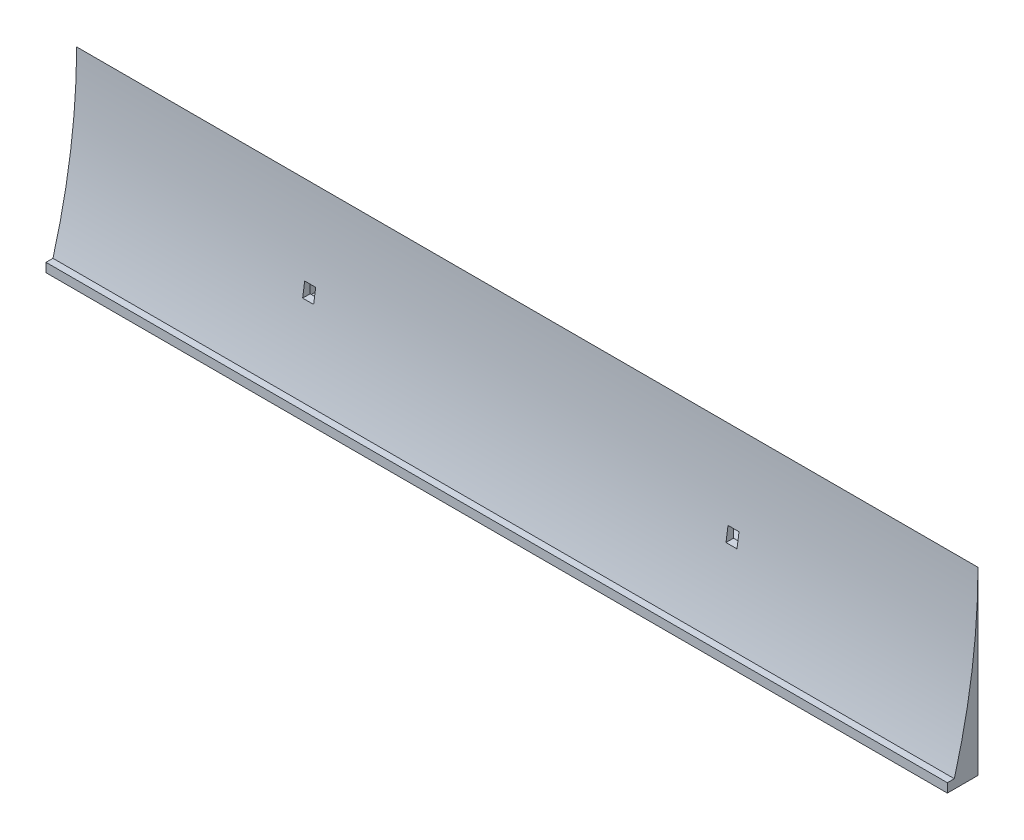
ISO-10303-21;
HEADER;
FILE_DESCRIPTION(('STEP AP214'),'2;1');
FILE_NAME('part.step','',(''),(''),'','','');
FILE_SCHEMA(('AUTOMOTIVE_DESIGN { 1 0 10303 214 1 1 1 1 }'));
ENDSEC;
DATA;
#1=APPLICATION_CONTEXT('core data for automotive mechanical design processes');
#2=APPLICATION_PROTOCOL_DEFINITION('international standard','automotive_design',2000,#1);
#3=PRODUCT_CONTEXT('',#1,'mechanical');
#4=PRODUCT('Part','Part','',(#3));
#5=PRODUCT_RELATED_PRODUCT_CATEGORY('part','',(#4));
#6=PRODUCT_DEFINITION_FORMATION('','',#4);
#7=PRODUCT_DEFINITION_CONTEXT('part definition',#1,'design');
#8=PRODUCT_DEFINITION('design','',#6,#7);
#9=PRODUCT_DEFINITION_SHAPE('','',#8);
#10=(LENGTH_UNIT() NAMED_UNIT(*) SI_UNIT(.MILLI.,.METRE.));
#11=(NAMED_UNIT(*) PLANE_ANGLE_UNIT() SI_UNIT($,.RADIAN.));
#12=(NAMED_UNIT(*) SI_UNIT($,.STERADIAN.) SOLID_ANGLE_UNIT());
#13=UNCERTAINTY_MEASURE_WITH_UNIT(LENGTH_MEASURE(1.E-05),#10,'distance_accuracy_value','');
#14=(GEOMETRIC_REPRESENTATION_CONTEXT(3) GLOBAL_UNCERTAINTY_ASSIGNED_CONTEXT((#13)) GLOBAL_UNIT_ASSIGNED_CONTEXT((#10,
#11,#12)) REPRESENTATION_CONTEXT('',''));
#15=CARTESIAN_POINT('',(0.,0.,0.));
#16=DIRECTION('',(0.,0.,1.));
#17=DIRECTION('',(1.,0.,0.));
#18=AXIS2_PLACEMENT_3D('',#15,#16,#17);
#19=CARTESIAN_POINT('',(0.,0.,0.));
#20=DIRECTION('',(0.,0.,1.));
#21=DIRECTION('',(1.,0.,0.));
#22=AXIS2_PLACEMENT_3D('',#19,#20,#21);
#23=PLANE('',#22);
#24=DIRECTION('',(1.,0.,0.));
#25=VECTOR('',#24,1.);
#26=CARTESIAN_POINT('',(114.368016386569,3.85,0.));
#27=LINE('',#26,#25);
#28=CARTESIAN_POINT('',(114.368016386569,3.85,0.));
#29=VERTEX_POINT('',#28);
#30=CARTESIAN_POINT('',(120.468016386569,3.85,0.));
#31=VERTEX_POINT('',#30);
#32=EDGE_CURVE('E369',#29,#31,#27,.T.);
#33=ORIENTED_EDGE('',*,*,#32,.F.);
#34=DIRECTION('',(0.,1.,0.));
#35=VECTOR('',#34,1.);
#36=CARTESIAN_POINT('',(114.368016386569,3.85,0.));
#37=LINE('',#36,#35);
#38=CARTESIAN_POINT('',(114.368016386569,-3.85,0.));
#39=VERTEX_POINT('',#38);
#40=EDGE_CURVE('E367',#39,#29,#37,.T.);
#41=ORIENTED_EDGE('',*,*,#40,.F.);
#42=DIRECTION('',(-1.,0.,0.));
#43=VECTOR('',#42,1.);
#44=CARTESIAN_POINT('',(114.368016386569,-3.85,0.));
#45=LINE('',#44,#43);
#46=CARTESIAN_POINT('',(120.468016386569,-3.85,0.));
#47=VERTEX_POINT('',#46);
#48=EDGE_CURVE('E376',#47,#39,#45,.T.);
#49=ORIENTED_EDGE('',*,*,#48,.F.);
#50=DIRECTION('',(0.,-1.,0.));
#51=VECTOR('',#50,1.);
#52=CARTESIAN_POINT('',(120.468016386569,3.85,0.));
#53=LINE('',#52,#51);
#54=EDGE_CURVE('E373',#31,#47,#53,.T.);
#55=ORIENTED_EDGE('',*,*,#54,.F.);
#56=EDGE_LOOP('',(#33,#41,#49,#55));
#57=FACE_BOUND('',#56,.T.);
#58=DIRECTION('',(0.,-1.,0.));
#59=VECTOR('',#58,1.);
#60=CARTESIAN_POINT('',(103.,-11.0503242977985,0.));
#61=LINE('',#60,#59);
#62=CARTESIAN_POINT('',(103.,19.2958445790979,0.));
#63=VERTEX_POINT('',#62);
#64=CARTESIAN_POINT('',(103.,-11.0503242977985,0.));
#65=VERTEX_POINT('',#64);
#66=EDGE_CURVE('E56',#63,#65,#61,.T.);
#67=ORIENTED_EDGE('',*,*,#66,.F.);
#68=DIRECTION('',(-1.,0.,0.));
#69=VECTOR('',#68,1.);
#70=CARTESIAN_POINT('',(103.,19.2958445790979,0.));
#71=LINE('',#70,#69);
#72=CARTESIAN_POINT('',(127.,19.2958445790979,0.));
#73=VERTEX_POINT('',#72);
#74=EDGE_CURVE('E269',#73,#63,#71,.T.);
#75=ORIENTED_EDGE('',*,*,#74,.F.);
#76=DIRECTION('',(0.,1.,0.));
#77=VECTOR('',#76,1.);
#78=CARTESIAN_POINT('',(127.,-11.0503242977985,0.));
#79=LINE('',#78,#77);
#80=CARTESIAN_POINT('',(127.,-11.0503242977985,0.));
#81=VERTEX_POINT('',#80);
#82=EDGE_CURVE('E283',#81,#73,#79,.T.);
#83=ORIENTED_EDGE('',*,*,#82,.F.);
#84=DIRECTION('',(1.,0.,0.));
#85=VECTOR('',#84,1.);
#86=CARTESIAN_POINT('',(103.,-11.0503242977985,0.));
#87=LINE('',#86,#85);
#88=EDGE_CURVE('E280',#65,#81,#87,.T.);
#89=ORIENTED_EDGE('',*,*,#88,.F.);
#90=EDGE_LOOP('',(#67,#75,#83,#89));
#91=FACE_BOUND('',#90,.T.);
#92=ADVANCED_FACE('F33',(#57,#91),#23,.F.);
#93=DIRECTION('',(0.,-1.,0.));
#94=VECTOR('',#93,1.);
#95=CARTESIAN_POINT('',(-114.368016386569,3.85,0.));
#96=LINE('',#95,#94);
#97=CARTESIAN_POINT('',(-114.368016386569,3.85,0.));
#98=VERTEX_POINT('',#97);
#99=CARTESIAN_POINT('',(-114.368016386569,-3.85,0.));
#100=VERTEX_POINT('',#99);
#101=EDGE_CURVE('E390',#98,#100,#96,.T.);
#102=ORIENTED_EDGE('',*,*,#101,.F.);
#103=DIRECTION('',(1.,0.,0.));
#104=VECTOR('',#103,1.);
#105=CARTESIAN_POINT('',(-114.368016386569,3.85,0.));
#106=LINE('',#105,#104);
#107=CARTESIAN_POINT('',(-120.468016386569,3.85,0.));
#108=VERTEX_POINT('',#107);
#109=EDGE_CURVE('E234',#108,#98,#106,.T.);
#110=ORIENTED_EDGE('',*,*,#109,.F.);
#111=DIRECTION('',(0.,1.,0.));
#112=VECTOR('',#111,1.);
#113=CARTESIAN_POINT('',(-120.468016386569,3.85,0.));
#114=LINE('',#113,#112);
#115=CARTESIAN_POINT('',(-120.468016386569,-3.85,0.));
#116=VERTEX_POINT('',#115);
#117=EDGE_CURVE('E396',#116,#108,#114,.T.);
#118=ORIENTED_EDGE('',*,*,#117,.F.);
#119=DIRECTION('',(-1.,0.,0.));
#120=VECTOR('',#119,1.);
#121=CARTESIAN_POINT('',(-114.368016386569,-3.85,0.));
#122=LINE('',#121,#120);
#123=EDGE_CURVE('E393',#100,#116,#122,.T.);
#124=ORIENTED_EDGE('',*,*,#123,.F.);
#125=EDGE_LOOP('',(#102,#110,#118,#124));
#126=FACE_BOUND('',#125,.T.);
#127=DIRECTION('',(1.,0.,0.));
#128=VECTOR('',#127,1.);
#129=CARTESIAN_POINT('',(-103.,-11.0503242977985,0.));
#130=LINE('',#129,#128);
#131=CARTESIAN_POINT('',(-127.,-11.0503242977985,0.));
#132=VERTEX_POINT('',#131);
#133=CARTESIAN_POINT('',(-103.,-11.0503242977985,0.));
#134=VERTEX_POINT('',#133);
#135=EDGE_CURVE('E311',#132,#134,#130,.T.);
#136=ORIENTED_EDGE('',*,*,#135,.F.);
#137=DIRECTION('',(0.,-1.,0.));
#138=VECTOR('',#137,1.);
#139=CARTESIAN_POINT('',(-127.,-11.0503242977985,0.));
#140=LINE('',#139,#138);
#141=CARTESIAN_POINT('',(-127.,19.2958445790979,0.));
#142=VERTEX_POINT('',#141);
#143=EDGE_CURVE('E321',#142,#132,#140,.T.);
#144=ORIENTED_EDGE('',*,*,#143,.F.);
#145=DIRECTION('',(-1.,0.,0.));
#146=VECTOR('',#145,1.);
#147=CARTESIAN_POINT('',(-103.,19.2958445790979,0.));
#148=LINE('',#147,#146);
#149=CARTESIAN_POINT('',(-103.,19.2958445790979,0.));
#150=VERTEX_POINT('',#149);
#151=EDGE_CURVE('E336',#150,#142,#148,.T.);
#152=ORIENTED_EDGE('',*,*,#151,.F.);
#153=DIRECTION('',(0.,1.,0.));
#154=VECTOR('',#153,1.);
#155=CARTESIAN_POINT('',(-103.,-11.0503242977985,0.));
#156=LINE('',#155,#154);
#157=EDGE_CURVE('E333',#134,#150,#156,.T.);
#158=ORIENTED_EDGE('',*,*,#157,.F.);
#159=EDGE_LOOP('',(#136,#144,#152,#158));
#160=FACE_BOUND('',#159,.T.);
#161=ADVANCED_FACE('F493',(#126,#160),#23,.F.);
#162=CARTESIAN_POINT('',(-250.,-50.,20.));
#163=DIRECTION('',(1.,0.,0.));
#164=DIRECTION('',(0.,0.,-1.));
#165=AXIS2_PLACEMENT_3D('',#162,#163,#164);
#166=PLANE('',#165);
#167=DIRECTION('',(0.,1.,0.));
#168=VECTOR('',#167,1.);
#169=CARTESIAN_POINT('',(-250.,0.,17.));
#170=LINE('',#169,#168);
#171=CARTESIAN_POINT('',(-250.,-50.,17.));
#172=VERTEX_POINT('',#171);
#173=CARTESIAN_POINT('',(-250.,-45.,17.));
#174=VERTEX_POINT('',#173);
#175=EDGE_CURVE('E418',#172,#174,#170,.T.);
#176=ORIENTED_EDGE('',*,*,#175,.T.);
#177=DIRECTION('',(0.,0.,-1.));
#178=VECTOR('',#177,1.);
#179=CARTESIAN_POINT('',(-250.,-45.0000000000001,1.61766507298448E-13));
#180=LINE('',#179,#178);
#181=CARTESIAN_POINT('',(-250.,-45.,13.1394947459706));
#182=VERTEX_POINT('',#181);
#183=EDGE_CURVE('E415',#174,#182,#180,.T.);
#184=ORIENTED_EDGE('',*,*,#183,.T.);
#185=CARTESIAN_POINT('',(-250.,50.,350.));
#186=DIRECTION('',(-1.,0.,0.));
#187=DIRECTION('',(0.,0.,1.));
#188=AXIS2_PLACEMENT_3D('',#185,#186,#187);
#189=CIRCLE('',#188,350.);
#190=CARTESIAN_POINT('',(-250.,50.,0.));
#191=VERTEX_POINT('',#190);
#192=EDGE_CURVE('E412',#191,#182,#189,.T.);
#193=ORIENTED_EDGE('',*,*,#192,.F.);
#194=DIRECTION('',(0.,-1.,0.));
#195=VECTOR('',#194,1.);
#196=CARTESIAN_POINT('',(-250.,-50.,0.));
#197=LINE('',#196,#195);
#198=CARTESIAN_POINT('',(-250.,-50.,0.));
#199=VERTEX_POINT('',#198);
#200=EDGE_CURVE('E430',#191,#199,#197,.T.);
#201=ORIENTED_EDGE('',*,*,#200,.T.);
#202=DIRECTION('',(0.,0.,-1.));
#203=VECTOR('',#202,1.);
#204=CARTESIAN_POINT('',(-250.,-50.,20.));
#205=LINE('',#204,#203);
#206=EDGE_CURVE('E443',#172,#199,#205,.T.);
#207=ORIENTED_EDGE('',*,*,#206,.F.);
#208=EDGE_LOOP('',(#176,#184,#193,#201,#207));
#209=FACE_BOUND('',#208,.T.);
#210=ADVANCED_FACE('F35',(#209),#166,.F.);
#211=CARTESIAN_POINT('',(250.,-50.,20.));
#212=DIRECTION('',(0.,1.,0.));
#213=DIRECTION('',(-1.,0.,0.));
#214=AXIS2_PLACEMENT_3D('',#211,#212,#213);
#215=PLANE('',#214);
#216=DIRECTION('',(-1.,0.,0.));
#217=VECTOR('',#216,1.);
#218=CARTESIAN_POINT('',(250.001,-50.,17.));
#219=LINE('',#218,#217);
#220=CARTESIAN_POINT('',(250.,-50.,17.));
#221=VERTEX_POINT('',#220);
#222=EDGE_CURVE('E422',#221,#172,#219,.T.);
#223=ORIENTED_EDGE('',*,*,#222,.T.);
#224=ORIENTED_EDGE('',*,*,#206,.T.);
#225=DIRECTION('',(1.,0.,0.));
#226=VECTOR('',#225,1.);
#227=CARTESIAN_POINT('',(250.,-50.,0.));
#228=LINE('',#227,#226);
#229=CARTESIAN_POINT('',(250.,-50.,0.));
#230=VERTEX_POINT('',#229);
#231=EDGE_CURVE('E433',#199,#230,#228,.T.);
#232=ORIENTED_EDGE('',*,*,#231,.T.);
#233=DIRECTION('',(0.,0.,-1.));
#234=VECTOR('',#233,1.);
#235=CARTESIAN_POINT('',(250.,-50.,20.));
#236=LINE('',#235,#234);
#237=EDGE_CURVE('E441',#221,#230,#236,.T.);
#238=ORIENTED_EDGE('',*,*,#237,.F.);
#239=EDGE_LOOP('',(#223,#224,#232,#238));
#240=FACE_BOUND('',#239,.T.);
#241=ADVANCED_FACE('F513',(#240),#215,.F.);
#242=CARTESIAN_POINT('',(250.,-50.,20.));
#243=DIRECTION('',(-1.,0.,0.));
#244=DIRECTION('',(0.,0.,1.));
#245=AXIS2_PLACEMENT_3D('',#242,#243,#244);
#246=PLANE('',#245);
#247=DIRECTION('',(0.,-1.,0.));
#248=VECTOR('',#247,1.);
#249=CARTESIAN_POINT('',(250.,0.,17.));
#250=LINE('',#249,#248);
#251=CARTESIAN_POINT('',(250.,-45.,17.));
#252=VERTEX_POINT('',#251);
#253=EDGE_CURVE('E409',#252,#221,#250,.T.);
#254=ORIENTED_EDGE('',*,*,#253,.T.);
#255=ORIENTED_EDGE('',*,*,#237,.T.);
#256=DIRECTION('',(0.,1.,0.));
#257=VECTOR('',#256,1.);
#258=CARTESIAN_POINT('',(250.,-50.,0.));
#259=LINE('',#258,#257);
#260=CARTESIAN_POINT('',(250.,50.,0.));
#261=VERTEX_POINT('',#260);
#262=EDGE_CURVE('E436',#230,#261,#259,.T.);
#263=ORIENTED_EDGE('',*,*,#262,.T.);
#264=CARTESIAN_POINT('',(250.,50.,350.));
#265=DIRECTION('',(-1.,0.,0.));
#266=DIRECTION('',(0.,0.,1.));
#267=AXIS2_PLACEMENT_3D('',#264,#265,#266);
#268=CIRCLE('',#267,350.);
#269=CARTESIAN_POINT('',(250.,-45.,13.1394947459706));
#270=VERTEX_POINT('',#269);
#271=EDGE_CURVE('E425',#270,#261,#268,.F.);
#272=ORIENTED_EDGE('',*,*,#271,.F.);
#273=DIRECTION('',(0.,0.,1.));
#274=VECTOR('',#273,1.);
#275=CARTESIAN_POINT('',(250.,-45.0000000000001,1.61766507298448E-13));
#276=LINE('',#275,#274);
#277=EDGE_CURVE('E382',#270,#252,#276,.T.);
#278=ORIENTED_EDGE('',*,*,#277,.T.);
#279=EDGE_LOOP('',(#254,#255,#263,#272,#278));
#280=FACE_BOUND('',#279,.T.);
#281=ADVANCED_FACE('F504',(#280),#246,.F.);
#282=DIRECTION('',(-1.,0.,0.));
#283=VECTOR('',#282,1.);
#284=CARTESIAN_POINT('',(100.,22.2958445790979,0.));
#285=LINE('',#284,#283);
#286=CARTESIAN_POINT('',(130.,22.2958445790979,0.));
#287=VERTEX_POINT('',#286);
#288=CARTESIAN_POINT('',(100.,22.2958445790979,0.));
#289=VERTEX_POINT('',#288);
#290=EDGE_CURVE('E305',#287,#289,#285,.T.);
#291=ORIENTED_EDGE('',*,*,#290,.T.);
#292=DIRECTION('',(0.,-1.,0.));
#293=VECTOR('',#292,1.);
#294=CARTESIAN_POINT('',(100.,-14.0503242977985,0.));
#295=LINE('',#294,#293);
#296=CARTESIAN_POINT('',(100.,-14.0503242977985,0.));
#297=VERTEX_POINT('',#296);
#298=EDGE_CURVE('E290',#289,#297,#295,.T.);
#299=ORIENTED_EDGE('',*,*,#298,.T.);
#300=DIRECTION('',(1.,0.,0.));
#301=VECTOR('',#300,1.);
#302=CARTESIAN_POINT('',(100.,-14.0503242977985,0.));
#303=LINE('',#302,#301);
#304=CARTESIAN_POINT('',(130.,-14.0503242977985,0.));
#305=VERTEX_POINT('',#304);
#306=EDGE_CURVE('E301',#297,#305,#303,.T.);
#307=ORIENTED_EDGE('',*,*,#306,.T.);
#308=DIRECTION('',(0.,1.,0.));
#309=VECTOR('',#308,1.);
#310=CARTESIAN_POINT('',(130.,-14.0503242977985,0.));
#311=LINE('',#310,#309);
#312=EDGE_CURVE('E48',#305,#287,#311,.T.);
#313=ORIENTED_EDGE('',*,*,#312,.T.);
#314=EDGE_LOOP('',(#291,#299,#307,#313));
#315=FACE_BOUND('',#314,.T.);
#316=DIRECTION('',(1.,0.,0.));
#317=VECTOR('',#316,1.);
#318=CARTESIAN_POINT('',(-100.,-14.0503242977985,0.));
#319=LINE('',#318,#317);
#320=CARTESIAN_POINT('',(-130.,-14.0503242977985,0.));
#321=VERTEX_POINT('',#320);
#322=CARTESIAN_POINT('',(-100.,-14.0503242977985,0.));
#323=VERTEX_POINT('',#322);
#324=EDGE_CURVE('E359',#321,#323,#319,.T.);
#325=ORIENTED_EDGE('',*,*,#324,.T.);
#326=DIRECTION('',(0.,1.,0.));
#327=VECTOR('',#326,1.);
#328=CARTESIAN_POINT('',(-100.,-14.0503242977985,0.));
#329=LINE('',#328,#327);
#330=CARTESIAN_POINT('',(-100.,22.2958445790979,0.));
#331=VERTEX_POINT('',#330);
#332=EDGE_CURVE('E230',#323,#331,#329,.T.);
#333=ORIENTED_EDGE('',*,*,#332,.T.);
#334=DIRECTION('',(-1.,0.,0.));
#335=VECTOR('',#334,1.);
#336=CARTESIAN_POINT('',(-100.,22.2958445790979,0.));
#337=LINE('',#336,#335);
#338=CARTESIAN_POINT('',(-130.,22.2958445790979,0.));
#339=VERTEX_POINT('',#338);
#340=EDGE_CURVE('E353',#331,#339,#337,.T.);
#341=ORIENTED_EDGE('',*,*,#340,.T.);
#342=DIRECTION('',(0.,-1.,0.));
#343=VECTOR('',#342,1.);
#344=CARTESIAN_POINT('',(-130.,-14.0503242977985,0.));
#345=LINE('',#344,#343);
#346=EDGE_CURVE('E356',#339,#321,#345,.T.);
#347=ORIENTED_EDGE('',*,*,#346,.T.);
#348=EDGE_LOOP('',(#325,#333,#341,#347));
#349=FACE_BOUND('',#348,.T.);
#350=ORIENTED_EDGE('',*,*,#200,.F.);
#351=DIRECTION('',(-1.,0.,0.));
#352=VECTOR('',#351,1.);
#353=CARTESIAN_POINT('',(250.,50.,0.));
#354=LINE('',#353,#352);
#355=EDGE_CURVE('E439',#261,#191,#354,.T.);
#356=ORIENTED_EDGE('',*,*,#355,.F.);
#357=ORIENTED_EDGE('',*,*,#262,.F.);
#358=ORIENTED_EDGE('',*,*,#231,.F.);
#359=EDGE_LOOP('',(#350,#356,#357,#358));
#360=FACE_BOUND('',#359,.T.);
#361=ADVANCED_FACE('F495',(#315,#349,#360),#23,.F.);
#362=CARTESIAN_POINT('',(250.001,0.,17.));
#363=DIRECTION('',(0.,0.,1.));
#364=DIRECTION('',(1.,0.,0.));
#365=AXIS2_PLACEMENT_3D('',#362,#363,#364);
#366=PLANE('',#365);
#367=DIRECTION('',(-1.,0.,0.));
#368=VECTOR('',#367,1.);
#369=CARTESIAN_POINT('',(250.001,-45.,17.));
#370=LINE('',#369,#368);
#371=EDGE_CURVE('E426',#252,#174,#370,.T.);
#372=ORIENTED_EDGE('',*,*,#371,.T.);
#373=ORIENTED_EDGE('',*,*,#175,.F.);
#374=ORIENTED_EDGE('',*,*,#222,.F.);
#375=ORIENTED_EDGE('',*,*,#253,.F.);
#376=EDGE_LOOP('',(#372,#373,#374,#375));
#377=FACE_BOUND('',#376,.T.);
#378=ADVANCED_FACE('F503',(#377),#366,.T.);
#379=CARTESIAN_POINT('',(250.001,-45.0000000000001,1.61766507298448E-13));
#380=DIRECTION('',(0.,1.,0.));
#381=DIRECTION('',(0.,0.,1.));
#382=AXIS2_PLACEMENT_3D('',#379,#380,#381);
#383=PLANE('',#382);
#384=DIRECTION('',(-1.,0.,0.));
#385=VECTOR('',#384,1.);
#386=CARTESIAN_POINT('',(250.001,-45.,13.1394947459706));
#387=LINE('',#386,#385);
#388=EDGE_CURVE('E421',#270,#182,#387,.T.);
#389=ORIENTED_EDGE('',*,*,#388,.T.);
#390=ORIENTED_EDGE('',*,*,#183,.F.);
#391=ORIENTED_EDGE('',*,*,#371,.F.);
#392=ORIENTED_EDGE('',*,*,#277,.F.);
#393=EDGE_LOOP('',(#389,#390,#391,#392));
#394=FACE_BOUND('',#393,.T.);
#395=ADVANCED_FACE('F510',(#394),#383,.T.);
#396=CARTESIAN_POINT('',(250.001,50.,350.));
#397=DIRECTION('',(-1.,0.,0.));
#398=DIRECTION('',(0.,0.,1.));
#399=AXIS2_PLACEMENT_3D('',#396,#397,#398);
#400=CYLINDRICAL_SURFACE('',#399,350.);
#401=DIRECTION('',(-1.,0.,0.));
#402=VECTOR('',#401,1.);
#403=CARTESIAN_POINT('',(250.001,-3.85000000000005,4.16741405703253));
#404=LINE('',#403,#402);
#405=CARTESIAN_POINT('',(120.468016386569,-3.85,4.16741405703253));
#406=VERTEX_POINT('',#405);
#407=CARTESIAN_POINT('',(114.368016386569,-3.85,4.16741405703253));
#408=VERTEX_POINT('',#407);
#409=EDGE_CURVE('E41',#406,#408,#404,.T.);
#410=ORIENTED_EDGE('',*,*,#409,.T.);
#411=CARTESIAN_POINT('',(114.368016386569,50.,350.));
#412=DIRECTION('',(-1.,0.,0.));
#413=DIRECTION('',(0.,0.,1.));
#414=AXIS2_PLACEMENT_3D('',#411,#412,#413);
#415=CIRCLE('',#414,350.);
#416=CARTESIAN_POINT('',(114.368016386569,3.85,3.05594471154286));
#417=VERTEX_POINT('',#416);
#418=EDGE_CURVE('E11',#408,#417,#415,.F.);
#419=ORIENTED_EDGE('',*,*,#418,.T.);
#420=DIRECTION('',(-1.,0.,0.));
#421=VECTOR('',#420,1.);
#422=CARTESIAN_POINT('',(250.001,3.85000000000005,3.05594471154286));
#423=LINE('',#422,#421);
#424=CARTESIAN_POINT('',(120.468016386569,3.85000000000005,3.05594471154286));
#425=VERTEX_POINT('',#424);
#426=EDGE_CURVE('E457',#417,#425,#423,.F.);
#427=ORIENTED_EDGE('',*,*,#426,.T.);
#428=CARTESIAN_POINT('',(120.468016386569,50.,350.));
#429=DIRECTION('',(1.,0.,0.));
#430=DIRECTION('',(0.,0.,-1.));
#431=AXIS2_PLACEMENT_3D('',#428,#429,#430);
#432=CIRCLE('',#431,350.);
#433=EDGE_CURVE('E460',#425,#406,#432,.F.);
#434=ORIENTED_EDGE('',*,*,#433,.T.);
#435=EDGE_LOOP('',(#410,#419,#427,#434));
#436=FACE_BOUND('',#435,.T.);
#437=CARTESIAN_POINT('',(-120.46801638657,50.,350.));
#438=DIRECTION('',(-1.,0.,0.));
#439=DIRECTION('',(0.,0.,1.));
#440=AXIS2_PLACEMENT_3D('',#437,#438,#439);
#441=CIRCLE('',#440,350.);
#442=CARTESIAN_POINT('',(-120.468016386569,-3.85,4.16741405703247));
#443=VERTEX_POINT('',#442);
#444=CARTESIAN_POINT('',(-120.46801638657,3.85,3.05594471154286));
#445=VERTEX_POINT('',#444);
#446=EDGE_CURVE('E451',#443,#445,#441,.F.);
#447=ORIENTED_EDGE('',*,*,#446,.T.);
#448=DIRECTION('',(-1.,0.,0.));
#449=VECTOR('',#448,1.);
#450=CARTESIAN_POINT('',(250.001,3.84999999999985,3.05594471154291));
#451=LINE('',#450,#449);
#452=CARTESIAN_POINT('',(-114.36801638657,3.85,3.05594471154286));
#453=VERTEX_POINT('',#452);
#454=EDGE_CURVE('E454',#445,#453,#451,.F.);
#455=ORIENTED_EDGE('',*,*,#454,.T.);
#456=CARTESIAN_POINT('',(-114.36801638657,50.,350.));
#457=DIRECTION('',(1.,0.,0.));
#458=DIRECTION('',(0.,0.,-1.));
#459=AXIS2_PLACEMENT_3D('',#456,#457,#458);
#460=CIRCLE('',#459,350.);
#461=CARTESIAN_POINT('',(-114.36801638657,-3.85,4.16741405703253));
#462=VERTEX_POINT('',#461);
#463=EDGE_CURVE('E445',#453,#462,#460,.F.);
#464=ORIENTED_EDGE('',*,*,#463,.T.);
#465=DIRECTION('',(-1.,0.,0.));
#466=VECTOR('',#465,1.);
#467=CARTESIAN_POINT('',(250.001,-3.84999999999985,4.16741405703247));
#468=LINE('',#467,#466);
#469=EDGE_CURVE('E448',#462,#443,#468,.T.);
#470=ORIENTED_EDGE('',*,*,#469,.T.);
#471=EDGE_LOOP('',(#447,#455,#464,#470));
#472=FACE_BOUND('',#471,.T.);
#473=ORIENTED_EDGE('',*,*,#271,.T.);
#474=ORIENTED_EDGE('',*,*,#355,.T.);
#475=ORIENTED_EDGE('',*,*,#192,.T.);
#476=ORIENTED_EDGE('',*,*,#388,.F.);
#477=EDGE_LOOP('',(#473,#474,#475,#476));
#478=FACE_BOUND('',#477,.T.);
#479=ADVANCED_FACE('F464',(#436,#472,#478),#400,.F.);
#480=CARTESIAN_POINT('',(-114.368016386569,3.85,10.));
#481=DIRECTION('',(0.,1.,0.));
#482=DIRECTION('',(-1.,0.,0.));
#483=AXIS2_PLACEMENT_3D('',#480,#481,#482);
#484=PLANE('',#483);
#485=DIRECTION('',(0.,0.,-1.));
#486=VECTOR('',#485,1.);
#487=CARTESIAN_POINT('',(-120.468016386569,3.85,10.));
#488=LINE('',#487,#486);
#489=EDGE_CURVE('E370',#445,#108,#488,.T.);
#490=ORIENTED_EDGE('',*,*,#489,.T.);
#491=ORIENTED_EDGE('',*,*,#109,.T.);
#492=DIRECTION('',(0.,0.,-1.));
#493=VECTOR('',#492,1.);
#494=CARTESIAN_POINT('',(-114.368016386569,3.85,10.));
#495=LINE('',#494,#493);
#496=EDGE_CURVE('E399',#453,#98,#495,.T.);
#497=ORIENTED_EDGE('',*,*,#496,.F.);
#498=ORIENTED_EDGE('',*,*,#454,.F.);
#499=EDGE_LOOP('',(#490,#491,#497,#498));
#500=FACE_BOUND('',#499,.T.);
#501=ADVANCED_FACE('F538',(#500),#484,.F.);
#502=CARTESIAN_POINT('',(-120.468016386569,3.85,10.));
#503=DIRECTION('',(-1.,0.,0.));
#504=DIRECTION('',(0.,0.,1.));
#505=AXIS2_PLACEMENT_3D('',#502,#503,#504);
#506=PLANE('',#505);
#507=DIRECTION('',(0.,0.,-1.));
#508=VECTOR('',#507,1.);
#509=CARTESIAN_POINT('',(-120.468016386569,-3.85,10.));
#510=LINE('',#509,#508);
#511=EDGE_CURVE('E401',#443,#116,#510,.T.);
#512=ORIENTED_EDGE('',*,*,#511,.T.);
#513=ORIENTED_EDGE('',*,*,#117,.T.);
#514=ORIENTED_EDGE('',*,*,#489,.F.);
#515=ORIENTED_EDGE('',*,*,#446,.F.);
#516=EDGE_LOOP('',(#512,#513,#514,#515));
#517=FACE_BOUND('',#516,.T.);
#518=ADVANCED_FACE('F542',(#517),#506,.F.);
#519=CARTESIAN_POINT('',(-114.368016386569,-3.85,10.));
#520=DIRECTION('',(0.,-1.,0.));
#521=DIRECTION('',(1.,0.,0.));
#522=AXIS2_PLACEMENT_3D('',#519,#520,#521);
#523=PLANE('',#522);
#524=DIRECTION('',(0.,0.,-1.));
#525=VECTOR('',#524,1.);
#526=CARTESIAN_POINT('',(-114.368016386569,-3.85,10.));
#527=LINE('',#526,#525);
#528=EDGE_CURVE('E403',#462,#100,#527,.T.);
#529=ORIENTED_EDGE('',*,*,#528,.T.);
#530=ORIENTED_EDGE('',*,*,#123,.T.);
#531=ORIENTED_EDGE('',*,*,#511,.F.);
#532=ORIENTED_EDGE('',*,*,#469,.F.);
#533=EDGE_LOOP('',(#529,#530,#531,#532));
#534=FACE_BOUND('',#533,.T.);
#535=ADVANCED_FACE('F547',(#534),#523,.F.);
#536=CARTESIAN_POINT('',(-114.368016386569,3.85,10.));
#537=DIRECTION('',(1.,0.,0.));
#538=DIRECTION('',(0.,0.,-1.));
#539=AXIS2_PLACEMENT_3D('',#536,#537,#538);
#540=PLANE('',#539);
#541=ORIENTED_EDGE('',*,*,#496,.T.);
#542=ORIENTED_EDGE('',*,*,#101,.T.);
#543=ORIENTED_EDGE('',*,*,#528,.F.);
#544=ORIENTED_EDGE('',*,*,#463,.F.);
#545=EDGE_LOOP('',(#541,#542,#543,#544));
#546=FACE_BOUND('',#545,.T.);
#547=ADVANCED_FACE('F544',(#546),#540,.F.);
#548=CARTESIAN_POINT('',(114.368016386569,3.85,10.));
#549=DIRECTION('',(-1.,0.,0.));
#550=DIRECTION('',(0.,0.,1.));
#551=AXIS2_PLACEMENT_3D('',#548,#549,#550);
#552=PLANE('',#551);
#553=DIRECTION('',(0.,0.,-1.));
#554=VECTOR('',#553,1.);
#555=CARTESIAN_POINT('',(114.368016386569,-3.85,10.));
#556=LINE('',#555,#554);
#557=EDGE_CURVE('E380',#408,#39,#556,.T.);
#558=ORIENTED_EDGE('',*,*,#557,.T.);
#559=ORIENTED_EDGE('',*,*,#40,.T.);
#560=DIRECTION('',(0.,0.,-1.));
#561=VECTOR('',#560,1.);
#562=CARTESIAN_POINT('',(114.368016386569,3.85,10.));
#563=LINE('',#562,#561);
#564=EDGE_CURVE('E379',#417,#29,#563,.T.);
#565=ORIENTED_EDGE('',*,*,#564,.F.);
#566=ORIENTED_EDGE('',*,*,#418,.F.);
#567=EDGE_LOOP('',(#558,#559,#565,#566));
#568=FACE_BOUND('',#567,.T.);
#569=ADVANCED_FACE('F480',(#568),#552,.F.);
#570=CARTESIAN_POINT('',(114.368016386569,-3.85,10.));
#571=DIRECTION('',(0.,-1.,0.));
#572=DIRECTION('',(1.,0.,0.));
#573=AXIS2_PLACEMENT_3D('',#570,#571,#572);
#574=PLANE('',#573);
#575=DIRECTION('',(0.,0.,-1.));
#576=VECTOR('',#575,1.);
#577=CARTESIAN_POINT('',(120.468016386569,-3.85,10.));
#578=LINE('',#577,#576);
#579=EDGE_CURVE('E383',#406,#47,#578,.T.);
#580=ORIENTED_EDGE('',*,*,#579,.T.);
#581=ORIENTED_EDGE('',*,*,#48,.T.);
#582=ORIENTED_EDGE('',*,*,#557,.F.);
#583=ORIENTED_EDGE('',*,*,#409,.F.);
#584=EDGE_LOOP('',(#580,#581,#582,#583));
#585=FACE_BOUND('',#584,.T.);
#586=ADVANCED_FACE('F470',(#585),#574,.F.);
#587=CARTESIAN_POINT('',(120.468016386569,3.85,10.));
#588=DIRECTION('',(1.,0.,0.));
#589=DIRECTION('',(0.,0.,-1.));
#590=AXIS2_PLACEMENT_3D('',#587,#588,#589);
#591=PLANE('',#590);
#592=DIRECTION('',(0.,0.,-1.));
#593=VECTOR('',#592,1.);
#594=CARTESIAN_POINT('',(120.468016386569,3.85,10.));
#595=LINE('',#594,#593);
#596=EDGE_CURVE('E385',#425,#31,#595,.T.);
#597=ORIENTED_EDGE('',*,*,#596,.T.);
#598=ORIENTED_EDGE('',*,*,#54,.T.);
#599=ORIENTED_EDGE('',*,*,#579,.F.);
#600=ORIENTED_EDGE('',*,*,#433,.F.);
#601=EDGE_LOOP('',(#597,#598,#599,#600));
#602=FACE_BOUND('',#601,.T.);
#603=ADVANCED_FACE('F472',(#602),#591,.F.);
#604=CARTESIAN_POINT('',(114.368016386569,3.85,10.));
#605=DIRECTION('',(0.,1.,0.));
#606=DIRECTION('',(-1.,0.,0.));
#607=AXIS2_PLACEMENT_3D('',#604,#605,#606);
#608=PLANE('',#607);
#609=ORIENTED_EDGE('',*,*,#564,.T.);
#610=ORIENTED_EDGE('',*,*,#32,.T.);
#611=ORIENTED_EDGE('',*,*,#596,.F.);
#612=ORIENTED_EDGE('',*,*,#426,.F.);
#613=EDGE_LOOP('',(#609,#610,#611,#612));
#614=FACE_BOUND('',#613,.T.);
#615=ADVANCED_FACE('F482',(#614),#608,.F.);
#616=CARTESIAN_POINT('',(-100.,-14.0503242977985,-25.));
#617=DIRECTION('',(1.,0.,0.));
#618=DIRECTION('',(0.,0.,-1.));
#619=AXIS2_PLACEMENT_3D('',#616,#617,#618);
#620=PLANE('',#619);
#621=ORIENTED_EDGE('',*,*,#332,.F.);
#622=DIRECTION('',(0.,0.,1.));
#623=VECTOR('',#622,1.);
#624=CARTESIAN_POINT('',(-100.,-14.0503242977985,-25.));
#625=LINE('',#624,#623);
#626=CARTESIAN_POINT('',(-100.,-14.0503242977985,-27.));
#627=VERTEX_POINT('',#626);
#628=EDGE_CURVE('E224',#627,#323,#625,.T.);
#629=ORIENTED_EDGE('',*,*,#628,.F.);
#630=DIRECTION('',(0.,-1.,0.));
#631=VECTOR('',#630,1.);
#632=CARTESIAN_POINT('',(-100.,-14.0503242977985,-27.));
#633=LINE('',#632,#631);
#634=CARTESIAN_POINT('',(-100.,22.2958445790979,-27.));
#635=VERTEX_POINT('',#634);
#636=EDGE_CURVE('E228',#635,#627,#633,.T.);
#637=ORIENTED_EDGE('',*,*,#636,.F.);
#638=DIRECTION('',(0.,0.,1.));
#639=VECTOR('',#638,1.);
#640=CARTESIAN_POINT('',(-100.,22.2958445790979,-25.));
#641=LINE('',#640,#639);
#642=EDGE_CURVE('E360',#635,#331,#641,.T.);
#643=ORIENTED_EDGE('',*,*,#642,.T.);
#644=EDGE_LOOP('',(#621,#629,#637,#643));
#645=FACE_BOUND('',#644,.T.);
#646=ADVANCED_FACE('F226',(#645),#620,.T.);
#647=CARTESIAN_POINT('',(-100.,-14.0503242977985,-25.));
#648=DIRECTION('',(0.,-1.,0.));
#649=DIRECTION('',(1.,0.,0.));
#650=AXIS2_PLACEMENT_3D('',#647,#648,#649);
#651=PLANE('',#650);
#652=ORIENTED_EDGE('',*,*,#324,.F.);
#653=DIRECTION('',(0.,0.,1.));
#654=VECTOR('',#653,1.);
#655=CARTESIAN_POINT('',(-130.,-14.0503242977985,-25.));
#656=LINE('',#655,#654);
#657=CARTESIAN_POINT('',(-130.,-14.0503242977985,-27.));
#658=VERTEX_POINT('',#657);
#659=EDGE_CURVE('E235',#658,#321,#656,.T.);
#660=ORIENTED_EDGE('',*,*,#659,.F.);
#661=DIRECTION('',(-1.,0.,0.));
#662=VECTOR('',#661,1.);
#663=CARTESIAN_POINT('',(-100.,-14.0503242977985,-27.));
#664=LINE('',#663,#662);
#665=EDGE_CURVE('E238',#627,#658,#664,.T.);
#666=ORIENTED_EDGE('',*,*,#665,.F.);
#667=ORIENTED_EDGE('',*,*,#628,.T.);
#668=EDGE_LOOP('',(#652,#660,#666,#667));
#669=FACE_BOUND('',#668,.T.);
#670=ADVANCED_FACE('F239',(#669),#651,.T.);
#671=CARTESIAN_POINT('',(-130.,-14.0503242977985,-25.));
#672=DIRECTION('',(-1.,0.,0.));
#673=DIRECTION('',(0.,0.,1.));
#674=AXIS2_PLACEMENT_3D('',#671,#672,#673);
#675=PLANE('',#674);
#676=ORIENTED_EDGE('',*,*,#346,.F.);
#677=DIRECTION('',(0.,0.,1.));
#678=VECTOR('',#677,1.);
#679=CARTESIAN_POINT('',(-130.,22.2958445790979,-25.));
#680=LINE('',#679,#678);
#681=CARTESIAN_POINT('',(-130.,22.2958445790979,-27.));
#682=VERTEX_POINT('',#681);
#683=EDGE_CURVE('E363',#682,#339,#680,.T.);
#684=ORIENTED_EDGE('',*,*,#683,.F.);
#685=DIRECTION('',(0.,1.,0.));
#686=VECTOR('',#685,1.);
#687=CARTESIAN_POINT('',(-130.,-14.0503242977985,-27.));
#688=LINE('',#687,#686);
#689=EDGE_CURVE('E243',#658,#682,#688,.T.);
#690=ORIENTED_EDGE('',*,*,#689,.F.);
#691=ORIENTED_EDGE('',*,*,#659,.T.);
#692=EDGE_LOOP('',(#676,#684,#690,#691));
#693=FACE_BOUND('',#692,.T.);
#694=ADVANCED_FACE('F566',(#693),#675,.T.);
#695=CARTESIAN_POINT('',(-100.,22.2958445790979,-25.));
#696=DIRECTION('',(0.,1.,0.));
#697=DIRECTION('',(-1.,0.,0.));
#698=AXIS2_PLACEMENT_3D('',#695,#696,#697);
#699=PLANE('',#698);
#700=ORIENTED_EDGE('',*,*,#340,.F.);
#701=ORIENTED_EDGE('',*,*,#642,.F.);
#702=DIRECTION('',(1.,0.,0.));
#703=VECTOR('',#702,1.);
#704=CARTESIAN_POINT('',(-100.,22.2958445790979,-27.));
#705=LINE('',#704,#703);
#706=EDGE_CURVE('E248',#682,#635,#705,.T.);
#707=ORIENTED_EDGE('',*,*,#706,.F.);
#708=ORIENTED_EDGE('',*,*,#683,.T.);
#709=EDGE_LOOP('',(#700,#701,#707,#708));
#710=FACE_BOUND('',#709,.T.);
#711=ADVANCED_FACE('F562',(#710),#699,.T.);
#712=CARTESIAN_POINT('',(-103.,-11.0503242977985,-25.));
#713=DIRECTION('',(0.,-1.,0.));
#714=DIRECTION('',(0.,0.,-1.));
#715=AXIS2_PLACEMENT_3D('',#712,#713,#714);
#716=PLANE('',#715);
#717=ORIENTED_EDGE('',*,*,#135,.T.);
#718=DIRECTION('',(0.,0.,1.));
#719=VECTOR('',#718,1.);
#720=CARTESIAN_POINT('',(-103.,-11.0503242977985,-25.));
#721=LINE('',#720,#719);
#722=CARTESIAN_POINT('',(-103.,-11.0503242977985,-25.));
#723=VERTEX_POINT('',#722);
#724=EDGE_CURVE('E330',#723,#134,#721,.T.);
#725=ORIENTED_EDGE('',*,*,#724,.F.);
#726=DIRECTION('',(1.,0.,0.));
#727=VECTOR('',#726,1.);
#728=CARTESIAN_POINT('',(-103.,-11.0503242977985,-25.));
#729=LINE('',#728,#727);
#730=CARTESIAN_POINT('',(-127.,-11.0503242977985,-25.));
#731=VERTEX_POINT('',#730);
#732=EDGE_CURVE('E317',#731,#723,#729,.T.);
#733=ORIENTED_EDGE('',*,*,#732,.F.);
#734=DIRECTION('',(0.,0.,1.));
#735=VECTOR('',#734,1.);
#736=CARTESIAN_POINT('',(-127.,-11.0503242977985,-25.));
#737=LINE('',#736,#735);
#738=EDGE_CURVE('E341',#731,#132,#737,.T.);
#739=ORIENTED_EDGE('',*,*,#738,.T.);
#740=EDGE_LOOP('',(#717,#725,#733,#739));
#741=FACE_BOUND('',#740,.T.);
#742=ADVANCED_FACE('F565',(#741),#716,.F.);
#743=CARTESIAN_POINT('',(-127.,-11.0503242977985,-25.));
#744=DIRECTION('',(-1.,0.,0.));
#745=DIRECTION('',(0.,0.,1.));
#746=AXIS2_PLACEMENT_3D('',#743,#744,#745);
#747=PLANE('',#746);
#748=ORIENTED_EDGE('',*,*,#143,.T.);
#749=ORIENTED_EDGE('',*,*,#738,.F.);
#750=DIRECTION('',(0.,-1.,0.));
#751=VECTOR('',#750,1.);
#752=CARTESIAN_POINT('',(-127.,-11.0503242977985,-25.));
#753=LINE('',#752,#751);
#754=CARTESIAN_POINT('',(-127.,19.2958445790979,-25.));
#755=VERTEX_POINT('',#754);
#756=EDGE_CURVE('E327',#755,#731,#753,.T.);
#757=ORIENTED_EDGE('',*,*,#756,.F.);
#758=DIRECTION('',(0.,0.,1.));
#759=VECTOR('',#758,1.);
#760=CARTESIAN_POINT('',(-127.,19.2958445790979,-25.));
#761=LINE('',#760,#759);
#762=EDGE_CURVE('E344',#755,#142,#761,.T.);
#763=ORIENTED_EDGE('',*,*,#762,.T.);
#764=EDGE_LOOP('',(#748,#749,#757,#763));
#765=FACE_BOUND('',#764,.T.);
#766=ADVANCED_FACE('F575',(#765),#747,.F.);
#767=CARTESIAN_POINT('',(-103.,19.2958445790979,-25.));
#768=DIRECTION('',(0.,1.,0.));
#769=DIRECTION('',(-1.,0.,0.));
#770=AXIS2_PLACEMENT_3D('',#767,#768,#769);
#771=PLANE('',#770);
#772=ORIENTED_EDGE('',*,*,#151,.T.);
#773=ORIENTED_EDGE('',*,*,#762,.F.);
#774=DIRECTION('',(-1.,0.,0.));
#775=VECTOR('',#774,1.);
#776=CARTESIAN_POINT('',(-103.,19.2958445790979,-25.));
#777=LINE('',#776,#775);
#778=CARTESIAN_POINT('',(-103.,19.2958445790979,-25.));
#779=VERTEX_POINT('',#778);
#780=EDGE_CURVE('E324',#779,#755,#777,.T.);
#781=ORIENTED_EDGE('',*,*,#780,.F.);
#782=DIRECTION('',(0.,0.,1.));
#783=VECTOR('',#782,1.);
#784=CARTESIAN_POINT('',(-103.,19.2958445790979,-25.));
#785=LINE('',#784,#783);
#786=EDGE_CURVE('E347',#779,#150,#785,.T.);
#787=ORIENTED_EDGE('',*,*,#786,.T.);
#788=EDGE_LOOP('',(#772,#773,#781,#787));
#789=FACE_BOUND('',#788,.T.);
#790=ADVANCED_FACE('F581',(#789),#771,.F.);
#791=CARTESIAN_POINT('',(-103.,-11.0503242977985,-25.));
#792=DIRECTION('',(1.,0.,0.));
#793=DIRECTION('',(0.,0.,-1.));
#794=AXIS2_PLACEMENT_3D('',#791,#792,#793);
#795=PLANE('',#794);
#796=ORIENTED_EDGE('',*,*,#157,.T.);
#797=ORIENTED_EDGE('',*,*,#786,.F.);
#798=DIRECTION('',(0.,1.,0.));
#799=VECTOR('',#798,1.);
#800=CARTESIAN_POINT('',(-103.,-11.0503242977985,-25.));
#801=LINE('',#800,#799);
#802=EDGE_CURVE('E320',#723,#779,#801,.T.);
#803=ORIENTED_EDGE('',*,*,#802,.F.);
#804=ORIENTED_EDGE('',*,*,#724,.T.);
#805=EDGE_LOOP('',(#796,#797,#803,#804));
#806=FACE_BOUND('',#805,.T.);
#807=ADVANCED_FACE('F577',(#806),#795,.F.);
#808=CARTESIAN_POINT('',(100.,-14.0503242977985,-25.));
#809=DIRECTION('',(-1.,0.,0.));
#810=DIRECTION('',(0.,0.,1.));
#811=AXIS2_PLACEMENT_3D('',#808,#809,#810);
#812=PLANE('',#811);
#813=ORIENTED_EDGE('',*,*,#298,.F.);
#814=DIRECTION('',(0.,0.,1.));
#815=VECTOR('',#814,1.);
#816=CARTESIAN_POINT('',(100.,22.2958445790979,-25.));
#817=LINE('',#816,#815);
#818=CARTESIAN_POINT('',(100.,22.2958445790979,-27.));
#819=VERTEX_POINT('',#818);
#820=EDGE_CURVE('E309',#819,#289,#817,.T.);
#821=ORIENTED_EDGE('',*,*,#820,.F.);
#822=DIRECTION('',(0.,1.,0.));
#823=VECTOR('',#822,1.);
#824=CARTESIAN_POINT('',(100.,22.2958445790979,-27.));
#825=LINE('',#824,#823);
#826=CARTESIAN_POINT('',(100.,-14.0503242977985,-27.));
#827=VERTEX_POINT('',#826);
#828=EDGE_CURVE('E253',#827,#819,#825,.T.);
#829=ORIENTED_EDGE('',*,*,#828,.F.);
#830=DIRECTION('',(0.,0.,1.));
#831=VECTOR('',#830,1.);
#832=CARTESIAN_POINT('',(100.,-14.0503242977985,-25.));
#833=LINE('',#832,#831);
#834=EDGE_CURVE('E308',#827,#297,#833,.T.);
#835=ORIENTED_EDGE('',*,*,#834,.T.);
#836=EDGE_LOOP('',(#813,#821,#829,#835));
#837=FACE_BOUND('',#836,.T.);
#838=ADVANCED_FACE('F580',(#837),#812,.T.);
#839=CARTESIAN_POINT('',(100.,22.2958445790979,-25.));
#840=DIRECTION('',(0.,1.,0.));
#841=DIRECTION('',(-1.,0.,0.));
#842=AXIS2_PLACEMENT_3D('',#839,#840,#841);
#843=PLANE('',#842);
#844=ORIENTED_EDGE('',*,*,#290,.F.);
#845=DIRECTION('',(0.,0.,1.));
#846=VECTOR('',#845,1.);
#847=CARTESIAN_POINT('',(130.,22.2958445790979,-25.));
#848=LINE('',#847,#846);
#849=CARTESIAN_POINT('',(130.,22.2958445790979,-27.));
#850=VERTEX_POINT('',#849);
#851=EDGE_CURVE('E312',#850,#287,#848,.T.);
#852=ORIENTED_EDGE('',*,*,#851,.F.);
#853=DIRECTION('',(1.,0.,0.));
#854=VECTOR('',#853,1.);
#855=CARTESIAN_POINT('',(100.,22.2958445790979,-27.));
#856=LINE('',#855,#854);
#857=EDGE_CURVE('E256',#819,#850,#856,.T.);
#858=ORIENTED_EDGE('',*,*,#857,.F.);
#859=ORIENTED_EDGE('',*,*,#820,.T.);
#860=EDGE_LOOP('',(#844,#852,#858,#859));
#861=FACE_BOUND('',#860,.T.);
#862=ADVANCED_FACE('F591',(#861),#843,.T.);
#863=CARTESIAN_POINT('',(130.,-14.0503242977985,-25.));
#864=DIRECTION('',(1.,0.,0.));
#865=DIRECTION('',(0.,0.,-1.));
#866=AXIS2_PLACEMENT_3D('',#863,#864,#865);
#867=PLANE('',#866);
#868=ORIENTED_EDGE('',*,*,#312,.F.);
#869=DIRECTION('',(0.,0.,1.));
#870=VECTOR('',#869,1.);
#871=CARTESIAN_POINT('',(130.,-14.0503242977985,-25.));
#872=LINE('',#871,#870);
#873=CARTESIAN_POINT('',(130.,-14.0503242977985,-27.));
#874=VERTEX_POINT('',#873);
#875=EDGE_CURVE('E314',#874,#305,#872,.T.);
#876=ORIENTED_EDGE('',*,*,#875,.F.);
#877=DIRECTION('',(0.,-1.,0.));
#878=VECTOR('',#877,1.);
#879=CARTESIAN_POINT('',(130.,22.2958445790979,-27.));
#880=LINE('',#879,#878);
#881=EDGE_CURVE('E259',#850,#874,#880,.T.);
#882=ORIENTED_EDGE('',*,*,#881,.F.);
#883=ORIENTED_EDGE('',*,*,#851,.T.);
#884=EDGE_LOOP('',(#868,#876,#882,#883));
#885=FACE_BOUND('',#884,.T.);
#886=ADVANCED_FACE('F597',(#885),#867,.T.);
#887=CARTESIAN_POINT('',(100.,-14.0503242977985,-25.));
#888=DIRECTION('',(0.,-1.,0.));
#889=DIRECTION('',(1.,0.,0.));
#890=AXIS2_PLACEMENT_3D('',#887,#888,#889);
#891=PLANE('',#890);
#892=ORIENTED_EDGE('',*,*,#306,.F.);
#893=ORIENTED_EDGE('',*,*,#834,.F.);
#894=DIRECTION('',(-1.,0.,0.));
#895=VECTOR('',#894,1.);
#896=CARTESIAN_POINT('',(100.,-14.0503242977985,-27.));
#897=LINE('',#896,#895);
#898=EDGE_CURVE('E262',#874,#827,#897,.T.);
#899=ORIENTED_EDGE('',*,*,#898,.F.);
#900=ORIENTED_EDGE('',*,*,#875,.T.);
#901=EDGE_LOOP('',(#892,#893,#899,#900));
#902=FACE_BOUND('',#901,.T.);
#903=ADVANCED_FACE('F593',(#902),#891,.T.);
#904=CARTESIAN_POINT('',(103.,-11.0503242977985,-25.));
#905=DIRECTION('',(-1.,0.,0.));
#906=DIRECTION('',(0.,0.,1.));
#907=AXIS2_PLACEMENT_3D('',#904,#905,#906);
#908=PLANE('',#907);
#909=ORIENTED_EDGE('',*,*,#66,.T.);
#910=DIRECTION('',(0.,0.,1.));
#911=VECTOR('',#910,1.);
#912=CARTESIAN_POINT('',(103.,-11.0503242977985,-25.));
#913=LINE('',#912,#911);
#914=CARTESIAN_POINT('',(103.,-11.0503242977985,-25.));
#915=VERTEX_POINT('',#914);
#916=EDGE_CURVE('E278',#915,#65,#913,.T.);
#917=ORIENTED_EDGE('',*,*,#916,.F.);
#918=DIRECTION('',(0.,-1.,0.));
#919=VECTOR('',#918,1.);
#920=CARTESIAN_POINT('',(103.,-11.0503242977985,-25.));
#921=LINE('',#920,#919);
#922=CARTESIAN_POINT('',(103.,19.2958445790979,-25.));
#923=VERTEX_POINT('',#922);
#924=EDGE_CURVE('E265',#923,#915,#921,.T.);
#925=ORIENTED_EDGE('',*,*,#924,.F.);
#926=DIRECTION('',(0.,0.,1.));
#927=VECTOR('',#926,1.);
#928=CARTESIAN_POINT('',(103.,19.2958445790979,-25.));
#929=LINE('',#928,#927);
#930=EDGE_CURVE('E288',#923,#63,#929,.T.);
#931=ORIENTED_EDGE('',*,*,#930,.T.);
#932=EDGE_LOOP('',(#909,#917,#925,#931));
#933=FACE_BOUND('',#932,.T.);
#934=ADVANCED_FACE('F596',(#933),#908,.F.);
#935=CARTESIAN_POINT('',(103.,19.2958445790979,-25.));
#936=DIRECTION('',(0.,1.,0.));
#937=DIRECTION('',(-1.,0.,0.));
#938=AXIS2_PLACEMENT_3D('',#935,#936,#937);
#939=PLANE('',#938);
#940=ORIENTED_EDGE('',*,*,#74,.T.);
#941=ORIENTED_EDGE('',*,*,#930,.F.);
#942=DIRECTION('',(-1.,0.,0.));
#943=VECTOR('',#942,1.);
#944=CARTESIAN_POINT('',(103.,19.2958445790979,-25.));
#945=LINE('',#944,#943);
#946=CARTESIAN_POINT('',(127.,19.2958445790979,-25.));
#947=VERTEX_POINT('',#946);
#948=EDGE_CURVE('E275',#947,#923,#945,.T.);
#949=ORIENTED_EDGE('',*,*,#948,.F.);
#950=DIRECTION('',(0.,0.,1.));
#951=VECTOR('',#950,1.);
#952=CARTESIAN_POINT('',(127.,19.2958445790979,-25.));
#953=LINE('',#952,#951);
#954=EDGE_CURVE('E291',#947,#73,#953,.T.);
#955=ORIENTED_EDGE('',*,*,#954,.T.);
#956=EDGE_LOOP('',(#940,#941,#949,#955));
#957=FACE_BOUND('',#956,.T.);
#958=ADVANCED_FACE('F606',(#957),#939,.F.);
#959=CARTESIAN_POINT('',(127.,-11.0503242977985,-25.));
#960=DIRECTION('',(1.,0.,0.));
#961=DIRECTION('',(0.,0.,-1.));
#962=AXIS2_PLACEMENT_3D('',#959,#960,#961);
#963=PLANE('',#962);
#964=ORIENTED_EDGE('',*,*,#82,.T.);
#965=ORIENTED_EDGE('',*,*,#954,.F.);
#966=DIRECTION('',(0.,1.,0.));
#967=VECTOR('',#966,1.);
#968=CARTESIAN_POINT('',(127.,-11.0503242977985,-25.));
#969=LINE('',#968,#967);
#970=CARTESIAN_POINT('',(127.,-11.0503242977985,-25.));
#971=VERTEX_POINT('',#970);
#972=EDGE_CURVE('E272',#971,#947,#969,.T.);
#973=ORIENTED_EDGE('',*,*,#972,.F.);
#974=DIRECTION('',(0.,0.,1.));
#975=VECTOR('',#974,1.);
#976=CARTESIAN_POINT('',(127.,-11.0503242977985,-25.));
#977=LINE('',#976,#975);
#978=EDGE_CURVE('E294',#971,#81,#977,.T.);
#979=ORIENTED_EDGE('',*,*,#978,.T.);
#980=EDGE_LOOP('',(#964,#965,#973,#979));
#981=FACE_BOUND('',#980,.T.);
#982=ADVANCED_FACE('F612',(#981),#963,.F.);
#983=CARTESIAN_POINT('',(103.,-11.0503242977985,-25.));
#984=DIRECTION('',(0.,-1.,0.));
#985=DIRECTION('',(0.,0.,-1.));
#986=AXIS2_PLACEMENT_3D('',#983,#984,#985);
#987=PLANE('',#986);
#988=ORIENTED_EDGE('',*,*,#88,.T.);
#989=ORIENTED_EDGE('',*,*,#978,.F.);
#990=DIRECTION('',(1.,0.,0.));
#991=VECTOR('',#990,1.);
#992=CARTESIAN_POINT('',(103.,-11.0503242977985,-25.));
#993=LINE('',#992,#991);
#994=EDGE_CURVE('E268',#915,#971,#993,.T.);
#995=ORIENTED_EDGE('',*,*,#994,.F.);
#996=ORIENTED_EDGE('',*,*,#916,.T.);
#997=EDGE_LOOP('',(#988,#989,#995,#996));
#998=FACE_BOUND('',#997,.T.);
#999=ADVANCED_FACE('F608',(#998),#987,.F.);
#1000=CARTESIAN_POINT('',(0.,0.,-25.));
#1001=DIRECTION('',(0.,0.,1.));
#1002=DIRECTION('',(1.,0.,0.));
#1003=AXIS2_PLACEMENT_3D('',#1000,#1001,#1002);
#1004=PLANE('',#1003);
#1005=ORIENTED_EDGE('',*,*,#948,.T.);
#1006=ORIENTED_EDGE('',*,*,#924,.T.);
#1007=ORIENTED_EDGE('',*,*,#994,.T.);
#1008=ORIENTED_EDGE('',*,*,#972,.T.);
#1009=EDGE_LOOP('',(#1005,#1006,#1007,#1008));
#1010=FACE_BOUND('',#1009,.T.);
#1011=ADVANCED_FACE('F611',(#1010),#1004,.T.);
#1012=CARTESIAN_POINT('',(0.,0.,-27.));
#1013=DIRECTION('',(0.,0.,1.));
#1014=DIRECTION('',(1.,0.,0.));
#1015=AXIS2_PLACEMENT_3D('',#1012,#1013,#1014);
#1016=PLANE('',#1015);
#1017=ORIENTED_EDGE('',*,*,#828,.T.);
#1018=ORIENTED_EDGE('',*,*,#857,.T.);
#1019=ORIENTED_EDGE('',*,*,#881,.T.);
#1020=ORIENTED_EDGE('',*,*,#898,.T.);
#1021=EDGE_LOOP('',(#1017,#1018,#1019,#1020));
#1022=FACE_BOUND('',#1021,.T.);
#1023=ADVANCED_FACE('F622',(#1022),#1016,.F.);
#1024=CARTESIAN_POINT('',(0.,0.,-25.));
#1025=DIRECTION('',(0.,0.,1.));
#1026=DIRECTION('',(1.,0.,0.));
#1027=AXIS2_PLACEMENT_3D('',#1024,#1025,#1026);
#1028=PLANE('',#1027);
#1029=ORIENTED_EDGE('',*,*,#780,.T.);
#1030=ORIENTED_EDGE('',*,*,#756,.T.);
#1031=ORIENTED_EDGE('',*,*,#732,.T.);
#1032=ORIENTED_EDGE('',*,*,#802,.T.);
#1033=EDGE_LOOP('',(#1029,#1030,#1031,#1032));
#1034=FACE_BOUND('',#1033,.T.);
#1035=ADVANCED_FACE('F626',(#1034),#1028,.T.);
#1036=CARTESIAN_POINT('',(0.,0.,-27.));
#1037=DIRECTION('',(0.,0.,1.));
#1038=DIRECTION('',(1.,0.,0.));
#1039=AXIS2_PLACEMENT_3D('',#1036,#1037,#1038);
#1040=PLANE('',#1039);
#1041=ORIENTED_EDGE('',*,*,#636,.T.);
#1042=ORIENTED_EDGE('',*,*,#665,.T.);
#1043=ORIENTED_EDGE('',*,*,#689,.T.);
#1044=ORIENTED_EDGE('',*,*,#706,.T.);
#1045=EDGE_LOOP('',(#1041,#1042,#1043,#1044));
#1046=FACE_BOUND('',#1045,.T.);
#1047=ADVANCED_FACE('F246',(#1046),#1040,.F.);
#1048=CLOSED_SHELL('',(#92,#161,#210,#241,#281,#361,#378,#395,#479,#501,#518,#535,#547,#569,
#586,#603,#615,#646,#670,#694,#711,#742,#766,#790,#807,#838,#862,#886,#903,#934,#958,#982,#999,
#1011,#1023,#1035,#1047));
#1049=MANIFOLD_SOLID_BREP('B2',#1048);
#1050=ADVANCED_BREP_SHAPE_REPRESENTATION('',(#18,#1049),#14);
#1051=SHAPE_DEFINITION_REPRESENTATION(#9,#1050);
ENDSEC;
END-ISO-10303-21;
